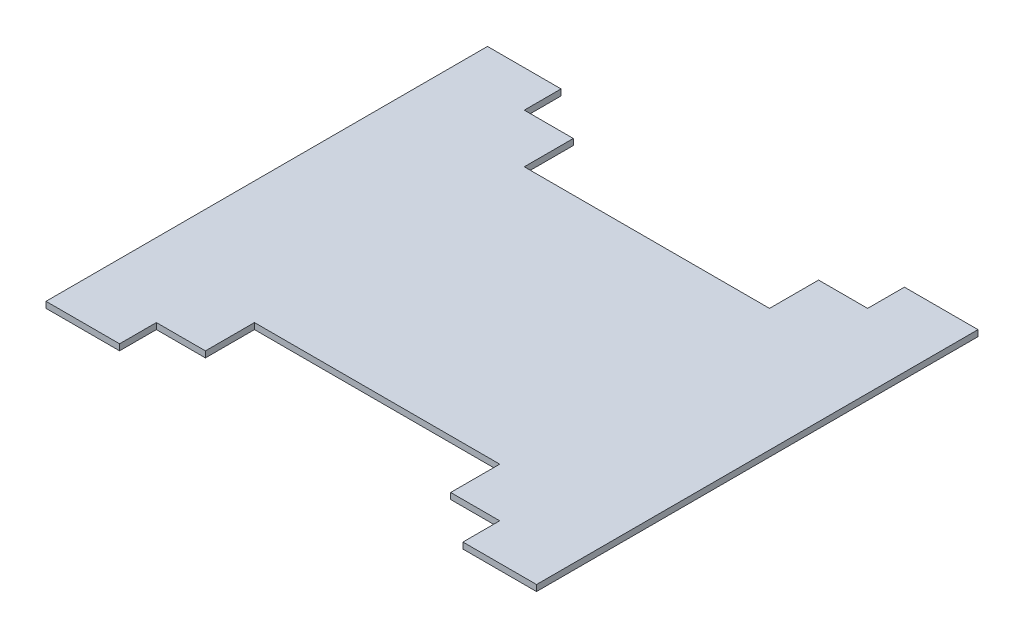
ISO-10303-21;
HEADER;
FILE_DESCRIPTION(('STEP AP214'),'2;1');
FILE_NAME('part.step','',(''),(''),'','','');
FILE_SCHEMA(('AUTOMOTIVE_DESIGN { 1 0 10303 214 1 1 1 1 }'));
ENDSEC;
DATA;
#1=APPLICATION_CONTEXT('core data for automotive mechanical design processes');
#2=APPLICATION_PROTOCOL_DEFINITION('international standard','automotive_design',2000,#1);
#3=PRODUCT_CONTEXT('',#1,'mechanical');
#4=PRODUCT('Part','Part','',(#3));
#5=PRODUCT_RELATED_PRODUCT_CATEGORY('part','',(#4));
#6=PRODUCT_DEFINITION_FORMATION('','',#4);
#7=PRODUCT_DEFINITION_CONTEXT('part definition',#1,'design');
#8=PRODUCT_DEFINITION('design','',#6,#7);
#9=PRODUCT_DEFINITION_SHAPE('','',#8);
#10=(LENGTH_UNIT() NAMED_UNIT(*) SI_UNIT(.MILLI.,.METRE.));
#11=(NAMED_UNIT(*) PLANE_ANGLE_UNIT() SI_UNIT($,.RADIAN.));
#12=(NAMED_UNIT(*) SI_UNIT($,.STERADIAN.) SOLID_ANGLE_UNIT());
#13=UNCERTAINTY_MEASURE_WITH_UNIT(LENGTH_MEASURE(1.E-05),#10,'distance_accuracy_value','');
#14=(GEOMETRIC_REPRESENTATION_CONTEXT(3) GLOBAL_UNCERTAINTY_ASSIGNED_CONTEXT((#13)) GLOBAL_UNIT_ASSIGNED_CONTEXT((#10,
#11,#12)) REPRESENTATION_CONTEXT('',''));
#15=CARTESIAN_POINT('',(0.,0.,0.));
#16=DIRECTION('',(0.,0.,1.));
#17=DIRECTION('',(1.,0.,0.));
#18=AXIS2_PLACEMENT_3D('',#15,#16,#17);
#19=CARTESIAN_POINT('',(-200.,5.,-180.));
#20=DIRECTION('',(1.,0.,0.));
#21=DIRECTION('',(0.,0.,-1.));
#22=AXIS2_PLACEMENT_3D('',#19,#20,#21);
#23=PLANE('',#22);
#24=DIRECTION('',(0.,0.,1.));
#25=VECTOR('',#24,1.);
#26=CARTESIAN_POINT('',(-200.,0.,-180.));
#27=LINE('',#26,#25);
#28=CARTESIAN_POINT('',(-200.,0.,-180.));
#29=VERTEX_POINT('',#28);
#30=CARTESIAN_POINT('',(-200.,0.,180.));
#31=VERTEX_POINT('',#30);
#32=EDGE_CURVE('E199',#29,#31,#27,.T.);
#33=ORIENTED_EDGE('',*,*,#32,.T.);
#34=DIRECTION('',(0.,-1.,0.));
#35=VECTOR('',#34,1.);
#36=CARTESIAN_POINT('',(-200.,5.,180.));
#37=LINE('',#36,#35);
#38=CARTESIAN_POINT('',(-200.,5.,180.));
#39=VERTEX_POINT('',#38);
#40=EDGE_CURVE('E11',#39,#31,#37,.T.);
#41=ORIENTED_EDGE('',*,*,#40,.F.);
#42=DIRECTION('',(0.,0.,1.));
#43=VECTOR('',#42,1.);
#44=CARTESIAN_POINT('',(-200.,5.,-180.));
#45=LINE('',#44,#43);
#46=CARTESIAN_POINT('',(-200.,5.,-180.));
#47=VERTEX_POINT('',#46);
#48=EDGE_CURVE('E237',#47,#39,#45,.T.);
#49=ORIENTED_EDGE('',*,*,#48,.F.);
#50=DIRECTION('',(0.,-1.,0.));
#51=VECTOR('',#50,1.);
#52=CARTESIAN_POINT('',(-200.,5.,-180.));
#53=LINE('',#52,#51);
#54=EDGE_CURVE('E195',#47,#29,#53,.T.);
#55=ORIENTED_EDGE('',*,*,#54,.T.);
#56=EDGE_LOOP('',(#33,#41,#49,#55));
#57=FACE_BOUND('',#56,.T.);
#58=ADVANCED_FACE('F31',(#57),#23,.F.);
#59=CARTESIAN_POINT('',(-200.,5.,180.));
#60=DIRECTION('',(0.,0.,-1.));
#61=DIRECTION('',(-1.,0.,0.));
#62=AXIS2_PLACEMENT_3D('',#59,#60,#61);
#63=PLANE('',#62);
#64=DIRECTION('',(1.,0.,0.));
#65=VECTOR('',#64,1.);
#66=CARTESIAN_POINT('',(-200.,0.,180.));
#67=LINE('',#66,#65);
#68=CARTESIAN_POINT('',(-140.,0.,180.));
#69=VERTEX_POINT('',#68);
#70=EDGE_CURVE('E202',#31,#69,#67,.T.);
#71=ORIENTED_EDGE('',*,*,#70,.T.);
#72=DIRECTION('',(0.,-1.,0.));
#73=VECTOR('',#72,1.);
#74=CARTESIAN_POINT('',(-140.,5.,180.));
#75=LINE('',#74,#73);
#76=CARTESIAN_POINT('',(-140.,5.,180.));
#77=VERTEX_POINT('',#76);
#78=EDGE_CURVE('E39',#77,#69,#75,.T.);
#79=ORIENTED_EDGE('',*,*,#78,.F.);
#80=DIRECTION('',(1.,0.,0.));
#81=VECTOR('',#80,1.);
#82=CARTESIAN_POINT('',(-200.,5.,180.));
#83=LINE('',#82,#81);
#84=EDGE_CURVE('E126',#39,#77,#83,.T.);
#85=ORIENTED_EDGE('',*,*,#84,.F.);
#86=ORIENTED_EDGE('',*,*,#40,.T.);
#87=EDGE_LOOP('',(#71,#79,#85,#86));
#88=FACE_BOUND('',#87,.T.);
#89=ADVANCED_FACE('F355',(#88),#63,.F.);
#90=CARTESIAN_POINT('',(-140.,5.,180.));
#91=DIRECTION('',(-1.,0.,0.));
#92=DIRECTION('',(0.,0.,1.));
#93=AXIS2_PLACEMENT_3D('',#90,#91,#92);
#94=PLANE('',#93);
#95=DIRECTION('',(0.,0.,-1.));
#96=VECTOR('',#95,1.);
#97=CARTESIAN_POINT('',(-140.,0.,180.));
#98=LINE('',#97,#96);
#99=CARTESIAN_POINT('',(-140.,0.,150.));
#100=VERTEX_POINT('',#99);
#101=EDGE_CURVE('E204',#69,#100,#98,.T.);
#102=ORIENTED_EDGE('',*,*,#101,.T.);
#103=DIRECTION('',(0.,-1.,0.));
#104=VECTOR('',#103,1.);
#105=CARTESIAN_POINT('',(-140.,5.,150.));
#106=LINE('',#105,#104);
#107=CARTESIAN_POINT('',(-140.,5.,150.));
#108=VERTEX_POINT('',#107);
#109=EDGE_CURVE('E280',#108,#100,#106,.T.);
#110=ORIENTED_EDGE('',*,*,#109,.F.);
#111=DIRECTION('',(0.,0.,-1.));
#112=VECTOR('',#111,1.);
#113=CARTESIAN_POINT('',(-140.,5.,180.));
#114=LINE('',#113,#112);
#115=EDGE_CURVE('E288',#77,#108,#114,.T.);
#116=ORIENTED_EDGE('',*,*,#115,.F.);
#117=ORIENTED_EDGE('',*,*,#78,.T.);
#118=EDGE_LOOP('',(#102,#110,#116,#117));
#119=FACE_BOUND('',#118,.T.);
#120=ADVANCED_FACE('F286',(#119),#94,.F.);
#121=CARTESIAN_POINT('',(-140.,5.,150.));
#122=DIRECTION('',(0.,0.,-1.));
#123=DIRECTION('',(-1.,0.,0.));
#124=AXIS2_PLACEMENT_3D('',#121,#122,#123);
#125=PLANE('',#124);
#126=DIRECTION('',(1.,0.,0.));
#127=VECTOR('',#126,1.);
#128=CARTESIAN_POINT('',(-140.,0.,150.));
#129=LINE('',#128,#127);
#130=CARTESIAN_POINT('',(-100.,0.,150.));
#131=VERTEX_POINT('',#130);
#132=EDGE_CURVE('E206',#100,#131,#129,.T.);
#133=ORIENTED_EDGE('',*,*,#132,.T.);
#134=DIRECTION('',(0.,-1.,0.));
#135=VECTOR('',#134,1.);
#136=CARTESIAN_POINT('',(-100.,5.,150.));
#137=LINE('',#136,#135);
#138=CARTESIAN_POINT('',(-100.,5.,150.));
#139=VERTEX_POINT('',#138);
#140=EDGE_CURVE('E277',#139,#131,#137,.T.);
#141=ORIENTED_EDGE('',*,*,#140,.F.);
#142=DIRECTION('',(1.,0.,0.));
#143=VECTOR('',#142,1.);
#144=CARTESIAN_POINT('',(-140.,5.,150.));
#145=LINE('',#144,#143);
#146=EDGE_CURVE('E306',#108,#139,#145,.T.);
#147=ORIENTED_EDGE('',*,*,#146,.F.);
#148=ORIENTED_EDGE('',*,*,#109,.T.);
#149=EDGE_LOOP('',(#133,#141,#147,#148));
#150=FACE_BOUND('',#149,.T.);
#151=ADVANCED_FACE('F297',(#150),#125,.F.);
#152=CARTESIAN_POINT('',(-100.,5.,150.));
#153=DIRECTION('',(-1.,0.,0.));
#154=DIRECTION('',(0.,0.,1.));
#155=AXIS2_PLACEMENT_3D('',#152,#153,#154);
#156=PLANE('',#155);
#157=DIRECTION('',(0.,0.,-1.));
#158=VECTOR('',#157,1.);
#159=CARTESIAN_POINT('',(-100.,0.,150.));
#160=LINE('',#159,#158);
#161=CARTESIAN_POINT('',(-100.,0.,110.));
#162=VERTEX_POINT('',#161);
#163=EDGE_CURVE('E208',#131,#162,#160,.T.);
#164=ORIENTED_EDGE('',*,*,#163,.T.);
#165=DIRECTION('',(0.,-1.,0.));
#166=VECTOR('',#165,1.);
#167=CARTESIAN_POINT('',(-100.,5.,110.));
#168=LINE('',#167,#166);
#169=CARTESIAN_POINT('',(-100.,5.,110.));
#170=VERTEX_POINT('',#169);
#171=EDGE_CURVE('E274',#170,#162,#168,.T.);
#172=ORIENTED_EDGE('',*,*,#171,.F.);
#173=DIRECTION('',(0.,0.,-1.));
#174=VECTOR('',#173,1.);
#175=CARTESIAN_POINT('',(-100.,5.,150.));
#176=LINE('',#175,#174);
#177=EDGE_CURVE('E303',#139,#170,#176,.T.);
#178=ORIENTED_EDGE('',*,*,#177,.F.);
#179=ORIENTED_EDGE('',*,*,#140,.T.);
#180=EDGE_LOOP('',(#164,#172,#178,#179));
#181=FACE_BOUND('',#180,.T.);
#182=ADVANCED_FACE('F301',(#181),#156,.F.);
#183=CARTESIAN_POINT('',(-100.,5.,110.));
#184=DIRECTION('',(0.,0.,-1.));
#185=DIRECTION('',(-1.,0.,0.));
#186=AXIS2_PLACEMENT_3D('',#183,#184,#185);
#187=PLANE('',#186);
#188=DIRECTION('',(1.,0.,0.));
#189=VECTOR('',#188,1.);
#190=CARTESIAN_POINT('',(-100.,0.,110.));
#191=LINE('',#190,#189);
#192=CARTESIAN_POINT('',(100.,0.,110.));
#193=VERTEX_POINT('',#192);
#194=EDGE_CURVE('E210',#162,#193,#191,.T.);
#195=ORIENTED_EDGE('',*,*,#194,.T.);
#196=DIRECTION('',(0.,-1.,0.));
#197=VECTOR('',#196,1.);
#198=CARTESIAN_POINT('',(100.,5.,110.));
#199=LINE('',#198,#197);
#200=CARTESIAN_POINT('',(100.,5.,110.));
#201=VERTEX_POINT('',#200);
#202=EDGE_CURVE('E271',#201,#193,#199,.T.);
#203=ORIENTED_EDGE('',*,*,#202,.F.);
#204=DIRECTION('',(1.,0.,0.));
#205=VECTOR('',#204,1.);
#206=CARTESIAN_POINT('',(-100.,5.,110.));
#207=LINE('',#206,#205);
#208=EDGE_CURVE('E305',#170,#201,#207,.T.);
#209=ORIENTED_EDGE('',*,*,#208,.F.);
#210=ORIENTED_EDGE('',*,*,#171,.T.);
#211=EDGE_LOOP('',(#195,#203,#209,#210));
#212=FACE_BOUND('',#211,.T.);
#213=ADVANCED_FACE('F368',(#212),#187,.F.);
#214=CARTESIAN_POINT('',(100.,5.,110.));
#215=DIRECTION('',(1.,0.,0.));
#216=DIRECTION('',(0.,0.,-1.));
#217=AXIS2_PLACEMENT_3D('',#214,#215,#216);
#218=PLANE('',#217);
#219=DIRECTION('',(0.,0.,1.));
#220=VECTOR('',#219,1.);
#221=CARTESIAN_POINT('',(100.,0.,110.));
#222=LINE('',#221,#220);
#223=CARTESIAN_POINT('',(100.,0.,150.));
#224=VERTEX_POINT('',#223);
#225=EDGE_CURVE('E212',#193,#224,#222,.T.);
#226=ORIENTED_EDGE('',*,*,#225,.T.);
#227=DIRECTION('',(0.,-1.,0.));
#228=VECTOR('',#227,1.);
#229=CARTESIAN_POINT('',(100.,5.,150.));
#230=LINE('',#229,#228);
#231=CARTESIAN_POINT('',(100.,5.,150.));
#232=VERTEX_POINT('',#231);
#233=EDGE_CURVE('E268',#232,#224,#230,.T.);
#234=ORIENTED_EDGE('',*,*,#233,.F.);
#235=DIRECTION('',(0.,0.,1.));
#236=VECTOR('',#235,1.);
#237=CARTESIAN_POINT('',(100.,5.,110.));
#238=LINE('',#237,#236);
#239=EDGE_CURVE('E308',#201,#232,#238,.T.);
#240=ORIENTED_EDGE('',*,*,#239,.F.);
#241=ORIENTED_EDGE('',*,*,#202,.T.);
#242=EDGE_LOOP('',(#226,#234,#240,#241));
#243=FACE_BOUND('',#242,.T.);
#244=ADVANCED_FACE('F371',(#243),#218,.F.);
#245=CARTESIAN_POINT('',(100.,5.,150.));
#246=DIRECTION('',(0.,0.,-1.));
#247=DIRECTION('',(-1.,0.,0.));
#248=AXIS2_PLACEMENT_3D('',#245,#246,#247);
#249=PLANE('',#248);
#250=DIRECTION('',(1.,0.,0.));
#251=VECTOR('',#250,1.);
#252=CARTESIAN_POINT('',(100.,0.,150.));
#253=LINE('',#252,#251);
#254=CARTESIAN_POINT('',(140.,0.,150.));
#255=VERTEX_POINT('',#254);
#256=EDGE_CURVE('E214',#224,#255,#253,.T.);
#257=ORIENTED_EDGE('',*,*,#256,.T.);
#258=DIRECTION('',(0.,-1.,0.));
#259=VECTOR('',#258,1.);
#260=CARTESIAN_POINT('',(140.,5.,150.));
#261=LINE('',#260,#259);
#262=CARTESIAN_POINT('',(140.,5.,150.));
#263=VERTEX_POINT('',#262);
#264=EDGE_CURVE('E265',#263,#255,#261,.T.);
#265=ORIENTED_EDGE('',*,*,#264,.F.);
#266=DIRECTION('',(1.,0.,0.));
#267=VECTOR('',#266,1.);
#268=CARTESIAN_POINT('',(100.,5.,150.));
#269=LINE('',#268,#267);
#270=EDGE_CURVE('E314',#232,#263,#269,.T.);
#271=ORIENTED_EDGE('',*,*,#270,.F.);
#272=ORIENTED_EDGE('',*,*,#233,.T.);
#273=EDGE_LOOP('',(#257,#265,#271,#272));
#274=FACE_BOUND('',#273,.T.);
#275=ADVANCED_FACE('F375',(#274),#249,.F.);
#276=CARTESIAN_POINT('',(140.,5.,150.));
#277=DIRECTION('',(1.,0.,0.));
#278=DIRECTION('',(0.,0.,-1.));
#279=AXIS2_PLACEMENT_3D('',#276,#277,#278);
#280=PLANE('',#279);
#281=DIRECTION('',(0.,0.,1.));
#282=VECTOR('',#281,1.);
#283=CARTESIAN_POINT('',(140.,0.,150.));
#284=LINE('',#283,#282);
#285=CARTESIAN_POINT('',(140.,0.,180.));
#286=VERTEX_POINT('',#285);
#287=EDGE_CURVE('E216',#255,#286,#284,.T.);
#288=ORIENTED_EDGE('',*,*,#287,.T.);
#289=DIRECTION('',(0.,-1.,0.));
#290=VECTOR('',#289,1.);
#291=CARTESIAN_POINT('',(140.,5.,180.));
#292=LINE('',#291,#290);
#293=CARTESIAN_POINT('',(140.,5.,180.));
#294=VERTEX_POINT('',#293);
#295=EDGE_CURVE('E262',#294,#286,#292,.T.);
#296=ORIENTED_EDGE('',*,*,#295,.F.);
#297=DIRECTION('',(0.,0.,1.));
#298=VECTOR('',#297,1.);
#299=CARTESIAN_POINT('',(140.,5.,150.));
#300=LINE('',#299,#298);
#301=EDGE_CURVE('E316',#263,#294,#300,.T.);
#302=ORIENTED_EDGE('',*,*,#301,.F.);
#303=ORIENTED_EDGE('',*,*,#264,.T.);
#304=EDGE_LOOP('',(#288,#296,#302,#303));
#305=FACE_BOUND('',#304,.T.);
#306=ADVANCED_FACE('F379',(#305),#280,.F.);
#307=CARTESIAN_POINT('',(140.,5.,180.));
#308=DIRECTION('',(0.,0.,-1.));
#309=DIRECTION('',(-1.,0.,0.));
#310=AXIS2_PLACEMENT_3D('',#307,#308,#309);
#311=PLANE('',#310);
#312=DIRECTION('',(1.,0.,0.));
#313=VECTOR('',#312,1.);
#314=CARTESIAN_POINT('',(140.,0.,180.));
#315=LINE('',#314,#313);
#316=CARTESIAN_POINT('',(200.,0.,180.));
#317=VERTEX_POINT('',#316);
#318=EDGE_CURVE('E218',#286,#317,#315,.T.);
#319=ORIENTED_EDGE('',*,*,#318,.T.);
#320=DIRECTION('',(0.,-1.,0.));
#321=VECTOR('',#320,1.);
#322=CARTESIAN_POINT('',(200.,5.,180.));
#323=LINE('',#322,#321);
#324=CARTESIAN_POINT('',(200.,5.,180.));
#325=VERTEX_POINT('',#324);
#326=EDGE_CURVE('E259',#325,#317,#323,.T.);
#327=ORIENTED_EDGE('',*,*,#326,.F.);
#328=DIRECTION('',(1.,0.,0.));
#329=VECTOR('',#328,1.);
#330=CARTESIAN_POINT('',(140.,5.,180.));
#331=LINE('',#330,#329);
#332=EDGE_CURVE('E318',#294,#325,#331,.T.);
#333=ORIENTED_EDGE('',*,*,#332,.F.);
#334=ORIENTED_EDGE('',*,*,#295,.T.);
#335=EDGE_LOOP('',(#319,#327,#333,#334));
#336=FACE_BOUND('',#335,.T.);
#337=ADVANCED_FACE('F383',(#336),#311,.F.);
#338=CARTESIAN_POINT('',(200.,5.,180.));
#339=DIRECTION('',(-1.,0.,0.));
#340=DIRECTION('',(0.,0.,1.));
#341=AXIS2_PLACEMENT_3D('',#338,#339,#340);
#342=PLANE('',#341);
#343=DIRECTION('',(0.,0.,-1.));
#344=VECTOR('',#343,1.);
#345=CARTESIAN_POINT('',(200.,0.,180.));
#346=LINE('',#345,#344);
#347=CARTESIAN_POINT('',(200.,0.,-180.));
#348=VERTEX_POINT('',#347);
#349=EDGE_CURVE('E220',#317,#348,#346,.T.);
#350=ORIENTED_EDGE('',*,*,#349,.T.);
#351=DIRECTION('',(0.,-1.,0.));
#352=VECTOR('',#351,1.);
#353=CARTESIAN_POINT('',(200.,5.,-180.));
#354=LINE('',#353,#352);
#355=CARTESIAN_POINT('',(200.,5.,-180.));
#356=VERTEX_POINT('',#355);
#357=EDGE_CURVE('E256',#356,#348,#354,.T.);
#358=ORIENTED_EDGE('',*,*,#357,.F.);
#359=DIRECTION('',(0.,0.,-1.));
#360=VECTOR('',#359,1.);
#361=CARTESIAN_POINT('',(200.,5.,180.));
#362=LINE('',#361,#360);
#363=EDGE_CURVE('E320',#325,#356,#362,.T.);
#364=ORIENTED_EDGE('',*,*,#363,.F.);
#365=ORIENTED_EDGE('',*,*,#326,.T.);
#366=EDGE_LOOP('',(#350,#358,#364,#365));
#367=FACE_BOUND('',#366,.T.);
#368=ADVANCED_FACE('F387',(#367),#342,.F.);
#369=CARTESIAN_POINT('',(140.,5.,-180.));
#370=DIRECTION('',(0.,0.,1.));
#371=DIRECTION('',(1.,0.,0.));
#372=AXIS2_PLACEMENT_3D('',#369,#370,#371);
#373=PLANE('',#372);
#374=DIRECTION('',(-1.,0.,0.));
#375=VECTOR('',#374,1.);
#376=CARTESIAN_POINT('',(140.,0.,-180.));
#377=LINE('',#376,#375);
#378=CARTESIAN_POINT('',(140.,0.,-180.));
#379=VERTEX_POINT('',#378);
#380=EDGE_CURVE('E222',#348,#379,#377,.T.);
#381=ORIENTED_EDGE('',*,*,#380,.T.);
#382=DIRECTION('',(0.,-1.,0.));
#383=VECTOR('',#382,1.);
#384=CARTESIAN_POINT('',(140.,5.,-180.));
#385=LINE('',#384,#383);
#386=CARTESIAN_POINT('',(140.,5.,-180.));
#387=VERTEX_POINT('',#386);
#388=EDGE_CURVE('E253',#387,#379,#385,.T.);
#389=ORIENTED_EDGE('',*,*,#388,.F.);
#390=DIRECTION('',(-1.,0.,0.));
#391=VECTOR('',#390,1.);
#392=CARTESIAN_POINT('',(140.,5.,-180.));
#393=LINE('',#392,#391);
#394=EDGE_CURVE('E322',#356,#387,#393,.T.);
#395=ORIENTED_EDGE('',*,*,#394,.F.);
#396=ORIENTED_EDGE('',*,*,#357,.T.);
#397=EDGE_LOOP('',(#381,#389,#395,#396));
#398=FACE_BOUND('',#397,.T.);
#399=ADVANCED_FACE('F391',(#398),#373,.F.);
#400=CARTESIAN_POINT('',(140.,5.,-150.));
#401=DIRECTION('',(1.,0.,0.));
#402=DIRECTION('',(0.,0.,-1.));
#403=AXIS2_PLACEMENT_3D('',#400,#401,#402);
#404=PLANE('',#403);
#405=DIRECTION('',(0.,0.,1.));
#406=VECTOR('',#405,1.);
#407=CARTESIAN_POINT('',(140.,0.,-150.));
#408=LINE('',#407,#406);
#409=CARTESIAN_POINT('',(140.,0.,-150.));
#410=VERTEX_POINT('',#409);
#411=EDGE_CURVE('E224',#379,#410,#408,.T.);
#412=ORIENTED_EDGE('',*,*,#411,.T.);
#413=DIRECTION('',(0.,-1.,0.));
#414=VECTOR('',#413,1.);
#415=CARTESIAN_POINT('',(140.,5.,-150.));
#416=LINE('',#415,#414);
#417=CARTESIAN_POINT('',(140.,5.,-150.));
#418=VERTEX_POINT('',#417);
#419=EDGE_CURVE('E250',#418,#410,#416,.T.);
#420=ORIENTED_EDGE('',*,*,#419,.F.);
#421=DIRECTION('',(0.,0.,1.));
#422=VECTOR('',#421,1.);
#423=CARTESIAN_POINT('',(140.,5.,-150.));
#424=LINE('',#423,#422);
#425=EDGE_CURVE('E324',#387,#418,#424,.T.);
#426=ORIENTED_EDGE('',*,*,#425,.F.);
#427=ORIENTED_EDGE('',*,*,#388,.T.);
#428=EDGE_LOOP('',(#412,#420,#426,#427));
#429=FACE_BOUND('',#428,.T.);
#430=ADVANCED_FACE('F395',(#429),#404,.F.);
#431=CARTESIAN_POINT('',(100.,5.,-150.));
#432=DIRECTION('',(0.,0.,1.));
#433=DIRECTION('',(1.,0.,0.));
#434=AXIS2_PLACEMENT_3D('',#431,#432,#433);
#435=PLANE('',#434);
#436=DIRECTION('',(-1.,0.,0.));
#437=VECTOR('',#436,1.);
#438=CARTESIAN_POINT('',(100.,0.,-150.));
#439=LINE('',#438,#437);
#440=CARTESIAN_POINT('',(100.,0.,-150.));
#441=VERTEX_POINT('',#440);
#442=EDGE_CURVE('E226',#410,#441,#439,.T.);
#443=ORIENTED_EDGE('',*,*,#442,.T.);
#444=DIRECTION('',(0.,-1.,0.));
#445=VECTOR('',#444,1.);
#446=CARTESIAN_POINT('',(100.,5.,-150.));
#447=LINE('',#446,#445);
#448=CARTESIAN_POINT('',(100.,5.,-150.));
#449=VERTEX_POINT('',#448);
#450=EDGE_CURVE('E247',#449,#441,#447,.T.);
#451=ORIENTED_EDGE('',*,*,#450,.F.);
#452=DIRECTION('',(-1.,0.,0.));
#453=VECTOR('',#452,1.);
#454=CARTESIAN_POINT('',(100.,5.,-150.));
#455=LINE('',#454,#453);
#456=EDGE_CURVE('E326',#418,#449,#455,.T.);
#457=ORIENTED_EDGE('',*,*,#456,.F.);
#458=ORIENTED_EDGE('',*,*,#419,.T.);
#459=EDGE_LOOP('',(#443,#451,#457,#458));
#460=FACE_BOUND('',#459,.T.);
#461=ADVANCED_FACE('F399',(#460),#435,.F.);
#462=CARTESIAN_POINT('',(100.,5.,-110.));
#463=DIRECTION('',(1.,0.,0.));
#464=DIRECTION('',(0.,0.,-1.));
#465=AXIS2_PLACEMENT_3D('',#462,#463,#464);
#466=PLANE('',#465);
#467=DIRECTION('',(0.,0.,1.));
#468=VECTOR('',#467,1.);
#469=CARTESIAN_POINT('',(100.,0.,-110.));
#470=LINE('',#469,#468);
#471=CARTESIAN_POINT('',(100.,0.,-110.));
#472=VERTEX_POINT('',#471);
#473=EDGE_CURVE('E228',#441,#472,#470,.T.);
#474=ORIENTED_EDGE('',*,*,#473,.T.);
#475=DIRECTION('',(0.,-1.,0.));
#476=VECTOR('',#475,1.);
#477=CARTESIAN_POINT('',(100.,5.,-110.));
#478=LINE('',#477,#476);
#479=CARTESIAN_POINT('',(100.,5.,-110.));
#480=VERTEX_POINT('',#479);
#481=EDGE_CURVE('E244',#480,#472,#478,.T.);
#482=ORIENTED_EDGE('',*,*,#481,.F.);
#483=DIRECTION('',(0.,0.,1.));
#484=VECTOR('',#483,1.);
#485=CARTESIAN_POINT('',(100.,5.,-110.));
#486=LINE('',#485,#484);
#487=EDGE_CURVE('E328',#449,#480,#486,.T.);
#488=ORIENTED_EDGE('',*,*,#487,.F.);
#489=ORIENTED_EDGE('',*,*,#450,.T.);
#490=EDGE_LOOP('',(#474,#482,#488,#489));
#491=FACE_BOUND('',#490,.T.);
#492=ADVANCED_FACE('F403',(#491),#466,.F.);
#493=CARTESIAN_POINT('',(-100.,5.,-110.));
#494=DIRECTION('',(0.,0.,1.));
#495=DIRECTION('',(1.,0.,0.));
#496=AXIS2_PLACEMENT_3D('',#493,#494,#495);
#497=PLANE('',#496);
#498=DIRECTION('',(-1.,0.,0.));
#499=VECTOR('',#498,1.);
#500=CARTESIAN_POINT('',(-100.,0.,-110.));
#501=LINE('',#500,#499);
#502=CARTESIAN_POINT('',(-100.,0.,-110.));
#503=VERTEX_POINT('',#502);
#504=EDGE_CURVE('E230',#472,#503,#501,.T.);
#505=ORIENTED_EDGE('',*,*,#504,.T.);
#506=DIRECTION('',(0.,-1.,0.));
#507=VECTOR('',#506,1.);
#508=CARTESIAN_POINT('',(-100.,5.,-110.));
#509=LINE('',#508,#507);
#510=CARTESIAN_POINT('',(-100.,5.,-110.));
#511=VERTEX_POINT('',#510);
#512=EDGE_CURVE('E241',#511,#503,#509,.T.);
#513=ORIENTED_EDGE('',*,*,#512,.F.);
#514=DIRECTION('',(-1.,0.,0.));
#515=VECTOR('',#514,1.);
#516=CARTESIAN_POINT('',(-100.,5.,-110.));
#517=LINE('',#516,#515);
#518=EDGE_CURVE('E330',#480,#511,#517,.T.);
#519=ORIENTED_EDGE('',*,*,#518,.F.);
#520=ORIENTED_EDGE('',*,*,#481,.T.);
#521=EDGE_LOOP('',(#505,#513,#519,#520));
#522=FACE_BOUND('',#521,.T.);
#523=ADVANCED_FACE('F336',(#522),#497,.F.);
#524=CARTESIAN_POINT('',(-100.,5.,-150.));
#525=DIRECTION('',(-1.,0.,0.));
#526=DIRECTION('',(0.,0.,1.));
#527=AXIS2_PLACEMENT_3D('',#524,#525,#526);
#528=PLANE('',#527);
#529=DIRECTION('',(0.,0.,-1.));
#530=VECTOR('',#529,1.);
#531=CARTESIAN_POINT('',(-100.,0.,-150.));
#532=LINE('',#531,#530);
#533=CARTESIAN_POINT('',(-100.,0.,-150.));
#534=VERTEX_POINT('',#533);
#535=EDGE_CURVE('E232',#503,#534,#532,.T.);
#536=ORIENTED_EDGE('',*,*,#535,.T.);
#537=DIRECTION('',(0.,-1.,0.));
#538=VECTOR('',#537,1.);
#539=CARTESIAN_POINT('',(-100.,5.,-150.));
#540=LINE('',#539,#538);
#541=CARTESIAN_POINT('',(-100.,5.,-150.));
#542=VERTEX_POINT('',#541);
#543=EDGE_CURVE('E190',#542,#534,#540,.T.);
#544=ORIENTED_EDGE('',*,*,#543,.F.);
#545=DIRECTION('',(0.,0.,-1.));
#546=VECTOR('',#545,1.);
#547=CARTESIAN_POINT('',(-100.,5.,-150.));
#548=LINE('',#547,#546);
#549=EDGE_CURVE('E181',#511,#542,#548,.T.);
#550=ORIENTED_EDGE('',*,*,#549,.F.);
#551=ORIENTED_EDGE('',*,*,#512,.T.);
#552=EDGE_LOOP('',(#536,#544,#550,#551));
#553=FACE_BOUND('',#552,.T.);
#554=ADVANCED_FACE('F340',(#553),#528,.F.);
#555=CARTESIAN_POINT('',(-140.,5.,-150.));
#556=DIRECTION('',(0.,0.,1.));
#557=DIRECTION('',(1.,0.,0.));
#558=AXIS2_PLACEMENT_3D('',#555,#556,#557);
#559=PLANE('',#558);
#560=DIRECTION('',(-1.,0.,0.));
#561=VECTOR('',#560,1.);
#562=CARTESIAN_POINT('',(-140.,0.,-150.));
#563=LINE('',#562,#561);
#564=CARTESIAN_POINT('',(-140.,0.,-150.));
#565=VERTEX_POINT('',#564);
#566=EDGE_CURVE('E189',#534,#565,#563,.T.);
#567=ORIENTED_EDGE('',*,*,#566,.T.);
#568=DIRECTION('',(0.,-1.,0.));
#569=VECTOR('',#568,1.);
#570=CARTESIAN_POINT('',(-140.,5.,-150.));
#571=LINE('',#570,#569);
#572=CARTESIAN_POINT('',(-140.,5.,-150.));
#573=VERTEX_POINT('',#572);
#574=EDGE_CURVE('E186',#573,#565,#571,.T.);
#575=ORIENTED_EDGE('',*,*,#574,.F.);
#576=DIRECTION('',(-1.,0.,0.));
#577=VECTOR('',#576,1.);
#578=CARTESIAN_POINT('',(-140.,5.,-150.));
#579=LINE('',#578,#577);
#580=EDGE_CURVE('E175',#542,#573,#579,.T.);
#581=ORIENTED_EDGE('',*,*,#580,.F.);
#582=ORIENTED_EDGE('',*,*,#543,.T.);
#583=EDGE_LOOP('',(#567,#575,#581,#582));
#584=FACE_BOUND('',#583,.T.);
#585=ADVANCED_FACE('F187',(#584),#559,.F.);
#586=CARTESIAN_POINT('',(-140.,5.,-180.));
#587=DIRECTION('',(-1.,0.,0.));
#588=DIRECTION('',(0.,0.,1.));
#589=AXIS2_PLACEMENT_3D('',#586,#587,#588);
#590=PLANE('',#589);
#591=DIRECTION('',(0.,0.,-1.));
#592=VECTOR('',#591,1.);
#593=CARTESIAN_POINT('',(-140.,0.,-180.));
#594=LINE('',#593,#592);
#595=CARTESIAN_POINT('',(-140.,0.,-180.));
#596=VERTEX_POINT('',#595);
#597=EDGE_CURVE('E112',#565,#596,#594,.T.);
#598=ORIENTED_EDGE('',*,*,#597,.T.);
#599=DIRECTION('',(0.,-1.,0.));
#600=VECTOR('',#599,1.);
#601=CARTESIAN_POINT('',(-140.,5.,-180.));
#602=LINE('',#601,#600);
#603=CARTESIAN_POINT('',(-140.,5.,-180.));
#604=VERTEX_POINT('',#603);
#605=EDGE_CURVE('E191',#604,#596,#602,.T.);
#606=ORIENTED_EDGE('',*,*,#605,.F.);
#607=DIRECTION('',(0.,0.,-1.));
#608=VECTOR('',#607,1.);
#609=CARTESIAN_POINT('',(-140.,5.,-180.));
#610=LINE('',#609,#608);
#611=EDGE_CURVE('E179',#573,#604,#610,.T.);
#612=ORIENTED_EDGE('',*,*,#611,.F.);
#613=ORIENTED_EDGE('',*,*,#574,.T.);
#614=EDGE_LOOP('',(#598,#606,#612,#613));
#615=FACE_BOUND('',#614,.T.);
#616=ADVANCED_FACE('F193',(#615),#590,.F.);
#617=CARTESIAN_POINT('',(-200.,5.,-180.));
#618=DIRECTION('',(0.,0.,1.));
#619=DIRECTION('',(1.,0.,0.));
#620=AXIS2_PLACEMENT_3D('',#617,#618,#619);
#621=PLANE('',#620);
#622=DIRECTION('',(-1.,0.,0.));
#623=VECTOR('',#622,1.);
#624=CARTESIAN_POINT('',(-200.,0.,-180.));
#625=LINE('',#624,#623);
#626=EDGE_CURVE('E118',#596,#29,#625,.T.);
#627=ORIENTED_EDGE('',*,*,#626,.T.);
#628=ORIENTED_EDGE('',*,*,#54,.F.);
#629=DIRECTION('',(-1.,0.,0.));
#630=VECTOR('',#629,1.);
#631=CARTESIAN_POINT('',(-200.,5.,-180.));
#632=LINE('',#631,#630);
#633=EDGE_CURVE('E47',#604,#47,#632,.T.);
#634=ORIENTED_EDGE('',*,*,#633,.F.);
#635=ORIENTED_EDGE('',*,*,#605,.T.);
#636=EDGE_LOOP('',(#627,#628,#634,#635));
#637=FACE_BOUND('',#636,.T.);
#638=ADVANCED_FACE('F344',(#637),#621,.F.);
#639=CARTESIAN_POINT('',(-200.,5.,180.));
#640=DIRECTION('',(0.,1.,0.));
#641=DIRECTION('',(0.,0.,1.));
#642=AXIS2_PLACEMENT_3D('',#639,#640,#641);
#643=PLANE('',#642);
#644=ORIENTED_EDGE('',*,*,#48,.T.);
#645=ORIENTED_EDGE('',*,*,#84,.T.);
#646=ORIENTED_EDGE('',*,*,#115,.T.);
#647=ORIENTED_EDGE('',*,*,#146,.T.);
#648=ORIENTED_EDGE('',*,*,#177,.T.);
#649=ORIENTED_EDGE('',*,*,#208,.T.);
#650=ORIENTED_EDGE('',*,*,#239,.T.);
#651=ORIENTED_EDGE('',*,*,#270,.T.);
#652=ORIENTED_EDGE('',*,*,#301,.T.);
#653=ORIENTED_EDGE('',*,*,#332,.T.);
#654=ORIENTED_EDGE('',*,*,#363,.T.);
#655=ORIENTED_EDGE('',*,*,#394,.T.);
#656=ORIENTED_EDGE('',*,*,#425,.T.);
#657=ORIENTED_EDGE('',*,*,#456,.T.);
#658=ORIENTED_EDGE('',*,*,#487,.T.);
#659=ORIENTED_EDGE('',*,*,#518,.T.);
#660=ORIENTED_EDGE('',*,*,#549,.T.);
#661=ORIENTED_EDGE('',*,*,#580,.T.);
#662=ORIENTED_EDGE('',*,*,#611,.T.);
#663=ORIENTED_EDGE('',*,*,#633,.T.);
#664=EDGE_LOOP('',(#644,#645,#646,#647,#648,#649,#650,#651,#652,#653,#654,#655,#656,#657,#658,
#659,#660,#661,#662,#663));
#665=FACE_BOUND('',#664,.T.);
#666=ADVANCED_FACE('F177',(#665),#643,.T.);
#667=CARTESIAN_POINT('',(-200.,0.,180.));
#668=DIRECTION('',(0.,1.,0.));
#669=DIRECTION('',(0.,0.,1.));
#670=AXIS2_PLACEMENT_3D('',#667,#668,#669);
#671=PLANE('',#670);
#672=ORIENTED_EDGE('',*,*,#32,.F.);
#673=ORIENTED_EDGE('',*,*,#626,.F.);
#674=ORIENTED_EDGE('',*,*,#597,.F.);
#675=ORIENTED_EDGE('',*,*,#566,.F.);
#676=ORIENTED_EDGE('',*,*,#535,.F.);
#677=ORIENTED_EDGE('',*,*,#504,.F.);
#678=ORIENTED_EDGE('',*,*,#473,.F.);
#679=ORIENTED_EDGE('',*,*,#442,.F.);
#680=ORIENTED_EDGE('',*,*,#411,.F.);
#681=ORIENTED_EDGE('',*,*,#380,.F.);
#682=ORIENTED_EDGE('',*,*,#349,.F.);
#683=ORIENTED_EDGE('',*,*,#318,.F.);
#684=ORIENTED_EDGE('',*,*,#287,.F.);
#685=ORIENTED_EDGE('',*,*,#256,.F.);
#686=ORIENTED_EDGE('',*,*,#225,.F.);
#687=ORIENTED_EDGE('',*,*,#194,.F.);
#688=ORIENTED_EDGE('',*,*,#163,.F.);
#689=ORIENTED_EDGE('',*,*,#132,.F.);
#690=ORIENTED_EDGE('',*,*,#101,.F.);
#691=ORIENTED_EDGE('',*,*,#70,.F.);
#692=EDGE_LOOP('',(#672,#673,#674,#675,#676,#677,#678,#679,#680,#681,#682,#683,#684,#685,#686,
#687,#688,#689,#690,#691));
#693=FACE_BOUND('',#692,.T.);
#694=ADVANCED_FACE('F292',(#693),#671,.F.);
#695=CLOSED_SHELL('',(#58,#89,#120,#151,#182,#213,#244,#275,#306,#337,#368,#399,#430,#461,#492,
#523,#554,#585,#616,#638,#666,#694));
#696=MANIFOLD_SOLID_BREP('B2',#695);
#697=ADVANCED_BREP_SHAPE_REPRESENTATION('',(#18,#696),#14);
#698=SHAPE_DEFINITION_REPRESENTATION(#9,#697);
ENDSEC;
END-ISO-10303-21;
